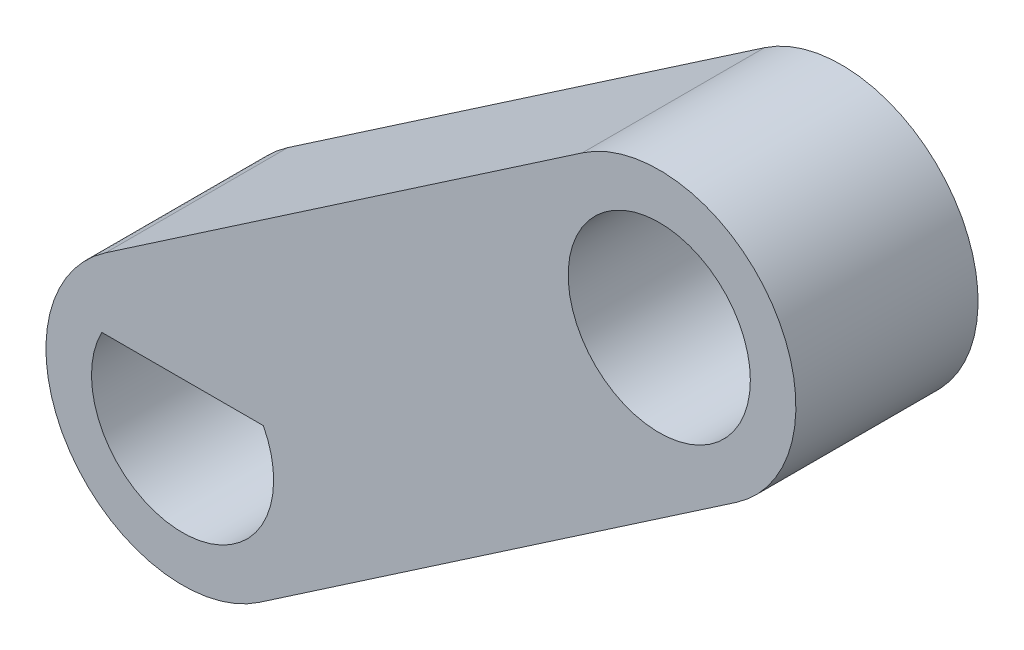
ISO-10303-21;
HEADER;
FILE_DESCRIPTION(('STEP AP214'),'2;1');
FILE_NAME('part.step','',(''),(''),'','','');
FILE_SCHEMA(('AUTOMOTIVE_DESIGN { 1 0 10303 214 1 1 1 1 }'));
ENDSEC;
DATA;
#1=APPLICATION_CONTEXT('core data for automotive mechanical design processes');
#2=APPLICATION_PROTOCOL_DEFINITION('international standard','automotive_design',2000,#1);
#3=PRODUCT_CONTEXT('',#1,'mechanical');
#4=PRODUCT('Part','Part','',(#3));
#5=PRODUCT_RELATED_PRODUCT_CATEGORY('part','',(#4));
#6=PRODUCT_DEFINITION_FORMATION('','',#4);
#7=PRODUCT_DEFINITION_CONTEXT('part definition',#1,'design');
#8=PRODUCT_DEFINITION('design','',#6,#7);
#9=PRODUCT_DEFINITION_SHAPE('','',#8);
#10=(LENGTH_UNIT() NAMED_UNIT(*) SI_UNIT(.MILLI.,.METRE.));
#11=(NAMED_UNIT(*) PLANE_ANGLE_UNIT() SI_UNIT($,.RADIAN.));
#12=(NAMED_UNIT(*) SI_UNIT($,.STERADIAN.) SOLID_ANGLE_UNIT());
#13=UNCERTAINTY_MEASURE_WITH_UNIT(LENGTH_MEASURE(1.E-05),#10,'distance_accuracy_value','');
#14=(GEOMETRIC_REPRESENTATION_CONTEXT(3) GLOBAL_UNCERTAINTY_ASSIGNED_CONTEXT((#13)) GLOBAL_UNIT_ASSIGNED_CONTEXT((#10,
#11,#12)) REPRESENTATION_CONTEXT('',''));
#15=CARTESIAN_POINT('',(0.,0.,0.));
#16=DIRECTION('',(0.,0.,1.));
#17=DIRECTION('',(1.,0.,0.));
#18=AXIS2_PLACEMENT_3D('',#15,#16,#17);
#19=CARTESIAN_POINT('',(-83.5922327227337,661.195137336145,-15.9136635374016));
#20=DIRECTION('',(0.,0.,1.));
#21=DIRECTION('',(1.,0.,0.));
#22=AXIS2_PLACEMENT_3D('',#19,#20,#21);
#23=PLANE('',#22);
#24=CARTESIAN_POINT('',(-83.5922327227337,661.195137336145,-15.9136635374016));
#25=DIRECTION('',(0.,0.,1.));
#26=DIRECTION('',(1.,0.,0.));
#27=AXIS2_PLACEMENT_3D('',#24,#25,#26);
#28=CIRCLE('',#27,14.9999999999999);
#29=CARTESIAN_POINT('',(-92.0395622803212,673.590403502932,-15.9136635374016));
#30=VERTEX_POINT('',#29);
#31=CARTESIAN_POINT('',(-75.1449031651463,648.799871169357,-15.9136635374016));
#32=VERTEX_POINT('',#31);
#33=EDGE_CURVE('E114',#30,#32,#28,.T.);
#34=ORIENTED_EDGE('',*,*,#33,.T.);
#35=DIRECTION('',(0.826351077785841,0.563155303839162,0.));
#36=VECTOR('',#35,1.);
#37=CARTESIAN_POINT('',(-75.1449031651463,648.799871169357,-15.9136635374016));
#38=LINE('',#37,#36);
#39=CARTESIAN_POINT('',(-22.8041540830278,684.469904457737,-15.9136635374016));
#40=VERTEX_POINT('',#39);
#41=EDGE_CURVE('E117',#32,#40,#38,.T.);
#42=ORIENTED_EDGE('',*,*,#41,.T.);
#43=CARTESIAN_POINT('',(-31.2514836406152,696.865170624525,-15.9136635374016));
#44=DIRECTION('',(0.,0.,1.));
#45=DIRECTION('',(1.,0.,0.));
#46=AXIS2_PLACEMENT_3D('',#43,#44,#45);
#47=CIRCLE('',#46,15.);
#48=CARTESIAN_POINT('',(-39.6988131982026,709.260436791313,-15.9136635374016));
#49=VERTEX_POINT('',#48);
#50=EDGE_CURVE('E120',#40,#49,#47,.T.);
#51=ORIENTED_EDGE('',*,*,#50,.T.);
#52=DIRECTION('',(-0.82635107778584,-0.563155303839164,0.));
#53=VECTOR('',#52,1.);
#54=CARTESIAN_POINT('',(-92.0395622803212,673.590403502932,-15.9136635374016));
#55=LINE('',#54,#53);
#56=EDGE_CURVE('E122',#49,#30,#55,.T.);
#57=ORIENTED_EDGE('',*,*,#56,.T.);
#58=EDGE_LOOP('',(#34,#42,#51,#57));
#59=FACE_BOUND('',#58,.T.);
#60=CARTESIAN_POINT('',(-31.2514836406152,696.865170624525,-15.9136635374016));
#61=DIRECTION('',(0.,0.,1.));
#62=DIRECTION('',(1.,0.,0.));
#63=AXIS2_PLACEMENT_3D('',#60,#61,#62);
#64=CIRCLE('',#63,10.);
#65=CARTESIAN_POINT('',(-21.2514836406152,696.865170624525,-15.9136635374016));
#66=VERTEX_POINT('',#65);
#67=EDGE_CURVE('E108',#66,#66,#64,.T.);
#68=ORIENTED_EDGE('',*,*,#67,.F.);
#69=EDGE_LOOP('',(#68));
#70=FACE_BOUND('',#69,.T.);
#71=DIRECTION('',(-1.,0.,0.));
#72=VECTOR('',#71,1.);
#73=CARTESIAN_POINT('',(-74.7223530881653,665.813062766244,-15.9136635374016));
#74=LINE('',#73,#72);
#75=CARTESIAN_POINT('',(-74.7223530881653,665.813062766244,-15.9136635374016));
#76=VERTEX_POINT('',#75);
#77=CARTESIAN_POINT('',(-92.4621123573022,665.813062766244,-15.9136635374016));
#78=VERTEX_POINT('',#77);
#79=EDGE_CURVE('E91',#76,#78,#74,.T.);
#80=ORIENTED_EDGE('',*,*,#79,.F.);
#81=CARTESIAN_POINT('',(-83.5922327227337,661.195137336145,-15.9136635374016));
#82=DIRECTION('',(0.,0.,1.));
#83=DIRECTION('',(1.,0.,0.));
#84=AXIS2_PLACEMENT_3D('',#81,#82,#83);
#85=CIRCLE('',#84,10.0000000004846);
#86=EDGE_CURVE('E97',#78,#76,#85,.T.);
#87=ORIENTED_EDGE('',*,*,#86,.F.);
#88=EDGE_LOOP('',(#80,#87));
#89=FACE_BOUND('',#88,.T.);
#90=ADVANCED_FACE('F39',(#59,#70,#89),#23,.T.);
#91=CARTESIAN_POINT('',(-83.5922327227337,661.195137336145,-35.9136635374016));
#92=DIRECTION('',(0.,0.,1.));
#93=DIRECTION('',(1.,0.,0.));
#94=AXIS2_PLACEMENT_3D('',#91,#92,#93);
#95=PLANE('',#94);
#96=CARTESIAN_POINT('',(-31.2514836406152,696.865170624525,-35.9136635374016));
#97=DIRECTION('',(0.,0.,1.));
#98=DIRECTION('',(1.,0.,0.));
#99=AXIS2_PLACEMENT_3D('',#96,#97,#98);
#100=CIRCLE('',#99,10.);
#101=CARTESIAN_POINT('',(-21.2514836406152,696.865170624525,-35.9136635374016));
#102=VERTEX_POINT('',#101);
#103=EDGE_CURVE('E107',#102,#102,#100,.T.);
#104=ORIENTED_EDGE('',*,*,#103,.T.);
#105=EDGE_LOOP('',(#104));
#106=FACE_BOUND('',#105,.T.);
#107=CARTESIAN_POINT('',(-83.5922327227337,661.195137336145,-35.9136635374016));
#108=DIRECTION('',(0.,0.,1.));
#109=DIRECTION('',(1.,0.,0.));
#110=AXIS2_PLACEMENT_3D('',#107,#108,#109);
#111=CIRCLE('',#110,14.9999999999999);
#112=CARTESIAN_POINT('',(-92.0395622803212,673.590403502932,-35.9136635374016));
#113=VERTEX_POINT('',#112);
#114=CARTESIAN_POINT('',(-75.1449031651463,648.799871169357,-35.9136635374016));
#115=VERTEX_POINT('',#114);
#116=EDGE_CURVE('E111',#113,#115,#111,.T.);
#117=ORIENTED_EDGE('',*,*,#116,.F.);
#118=DIRECTION('',(-0.82635107778584,-0.563155303839164,0.));
#119=VECTOR('',#118,1.);
#120=CARTESIAN_POINT('',(-92.0395622803212,673.590403502932,-35.9136635374016));
#121=LINE('',#120,#119);
#122=CARTESIAN_POINT('',(-39.6988131982026,709.260436791313,-35.9136635374016));
#123=VERTEX_POINT('',#122);
#124=EDGE_CURVE('E118',#123,#113,#121,.T.);
#125=ORIENTED_EDGE('',*,*,#124,.F.);
#126=CARTESIAN_POINT('',(-31.2514836406152,696.865170624525,-35.9136635374016));
#127=DIRECTION('',(0.,0.,1.));
#128=DIRECTION('',(1.,0.,0.));
#129=AXIS2_PLACEMENT_3D('',#126,#127,#128);
#130=CIRCLE('',#129,15.);
#131=CARTESIAN_POINT('',(-22.8041540830278,684.469904457737,-35.9136635374016));
#132=VERTEX_POINT('',#131);
#133=EDGE_CURVE('E129',#132,#123,#130,.T.);
#134=ORIENTED_EDGE('',*,*,#133,.F.);
#135=DIRECTION('',(0.826351077785841,0.563155303839162,0.));
#136=VECTOR('',#135,1.);
#137=CARTESIAN_POINT('',(-75.1449031651463,648.799871169357,-35.9136635374016));
#138=LINE('',#137,#136);
#139=EDGE_CURVE('E127',#115,#132,#138,.T.);
#140=ORIENTED_EDGE('',*,*,#139,.F.);
#141=EDGE_LOOP('',(#117,#125,#134,#140));
#142=FACE_BOUND('',#141,.T.);
#143=CARTESIAN_POINT('',(-83.5922327227337,661.195137336145,-35.9136635374016));
#144=DIRECTION('',(0.,0.,1.));
#145=DIRECTION('',(1.,0.,0.));
#146=AXIS2_PLACEMENT_3D('',#143,#144,#145);
#147=CIRCLE('',#146,10.0000000004846);
#148=CARTESIAN_POINT('',(-92.4621123573022,665.813062766244,-35.9136635374016));
#149=VERTEX_POINT('',#148);
#150=CARTESIAN_POINT('',(-74.7223530881653,665.813062766244,-35.9136635374016));
#151=VERTEX_POINT('',#150);
#152=EDGE_CURVE('E61',#149,#151,#147,.T.);
#153=ORIENTED_EDGE('',*,*,#152,.T.);
#154=DIRECTION('',(-1.,0.,0.));
#155=VECTOR('',#154,1.);
#156=CARTESIAN_POINT('',(-74.7223530881653,665.813062766244,-35.9136635374016));
#157=LINE('',#156,#155);
#158=EDGE_CURVE('E101',#151,#149,#157,.T.);
#159=ORIENTED_EDGE('',*,*,#158,.T.);
#160=EDGE_LOOP('',(#153,#159));
#161=FACE_BOUND('',#160,.T.);
#162=ADVANCED_FACE('F147',(#106,#142,#161),#95,.F.);
#163=CARTESIAN_POINT('',(-83.5922327227337,661.195137336145,-15.9136635374016));
#164=DIRECTION('',(0.,0.,-1.));
#165=DIRECTION('',(-1.,0.,0.));
#166=AXIS2_PLACEMENT_3D('',#163,#164,#165);
#167=CYLINDRICAL_SURFACE('',#166,14.9999999999999);
#168=ORIENTED_EDGE('',*,*,#116,.T.);
#169=DIRECTION('',(0.,0.,-1.));
#170=VECTOR('',#169,1.);
#171=CARTESIAN_POINT('',(-75.1449031651463,648.799871169357,-15.9136635374016));
#172=LINE('',#171,#170);
#173=EDGE_CURVE('E11',#32,#115,#172,.T.);
#174=ORIENTED_EDGE('',*,*,#173,.F.);
#175=ORIENTED_EDGE('',*,*,#33,.F.);
#176=DIRECTION('',(0.,0.,-1.));
#177=VECTOR('',#176,1.);
#178=CARTESIAN_POINT('',(-92.0395622803212,673.590403502932,-15.9136635374016));
#179=LINE('',#178,#177);
#180=EDGE_CURVE('E124',#30,#113,#179,.T.);
#181=ORIENTED_EDGE('',*,*,#180,.T.);
#182=EDGE_LOOP('',(#168,#174,#175,#181));
#183=FACE_BOUND('',#182,.T.);
#184=ADVANCED_FACE('F41',(#183),#167,.T.);
#185=CARTESIAN_POINT('',(-75.1449031651463,648.799871169357,-15.9136635374016));
#186=DIRECTION('',(-0.563155303839162,0.826351077785841,0.));
#187=DIRECTION('',(-0.826351077785841,-0.563155303839162,0.));
#188=AXIS2_PLACEMENT_3D('',#185,#186,#187);
#189=PLANE('',#188);
#190=ORIENTED_EDGE('',*,*,#139,.T.);
#191=DIRECTION('',(0.,0.,-1.));
#192=VECTOR('',#191,1.);
#193=CARTESIAN_POINT('',(-22.8041540830278,684.469904457737,-15.9136635374016));
#194=LINE('',#193,#192);
#195=EDGE_CURVE('E47',#40,#132,#194,.T.);
#196=ORIENTED_EDGE('',*,*,#195,.F.);
#197=ORIENTED_EDGE('',*,*,#41,.F.);
#198=ORIENTED_EDGE('',*,*,#173,.T.);
#199=EDGE_LOOP('',(#190,#196,#197,#198));
#200=FACE_BOUND('',#199,.T.);
#201=ADVANCED_FACE('F158',(#200),#189,.F.);
#202=CARTESIAN_POINT('',(-31.2514836406152,696.865170624525,-15.9136635374016));
#203=DIRECTION('',(0.,0.,-1.));
#204=DIRECTION('',(-1.,0.,0.));
#205=AXIS2_PLACEMENT_3D('',#202,#203,#204);
#206=CYLINDRICAL_SURFACE('',#205,15.);
#207=ORIENTED_EDGE('',*,*,#133,.T.);
#208=DIRECTION('',(0.,0.,-1.));
#209=VECTOR('',#208,1.);
#210=CARTESIAN_POINT('',(-39.6988131982026,709.260436791313,-15.9136635374016));
#211=LINE('',#210,#209);
#212=EDGE_CURVE('E134',#49,#123,#211,.T.);
#213=ORIENTED_EDGE('',*,*,#212,.F.);
#214=ORIENTED_EDGE('',*,*,#50,.F.);
#215=ORIENTED_EDGE('',*,*,#195,.T.);
#216=EDGE_LOOP('',(#207,#213,#214,#215));
#217=FACE_BOUND('',#216,.T.);
#218=ADVANCED_FACE('F141',(#217),#206,.T.);
#219=CARTESIAN_POINT('',(-92.0395622803212,673.590403502932,-15.9136635374016));
#220=DIRECTION('',(0.563155303839164,-0.82635107778584,0.));
#221=DIRECTION('',(0.82635107778584,0.563155303839164,0.));
#222=AXIS2_PLACEMENT_3D('',#219,#220,#221);
#223=PLANE('',#222);
#224=ORIENTED_EDGE('',*,*,#124,.T.);
#225=ORIENTED_EDGE('',*,*,#180,.F.);
#226=ORIENTED_EDGE('',*,*,#56,.F.);
#227=ORIENTED_EDGE('',*,*,#212,.T.);
#228=EDGE_LOOP('',(#224,#225,#226,#227));
#229=FACE_BOUND('',#228,.T.);
#230=ADVANCED_FACE('F151',(#229),#223,.F.);
#231=CARTESIAN_POINT('',(-31.2514836406152,696.865170624525,-15.9136635374016));
#232=DIRECTION('',(0.,0.,-1.));
#233=DIRECTION('',(-1.,0.,0.));
#234=AXIS2_PLACEMENT_3D('',#231,#232,#233);
#235=CYLINDRICAL_SURFACE('',#234,10.);
#236=ORIENTED_EDGE('',*,*,#67,.T.);
#237=EDGE_LOOP('',(#236));
#238=FACE_BOUND('',#237,.T.);
#239=ORIENTED_EDGE('',*,*,#103,.F.);
#240=EDGE_LOOP('',(#239));
#241=FACE_BOUND('',#240,.T.);
#242=ADVANCED_FACE('F173',(#238,#241),#235,.F.);
#243=CARTESIAN_POINT('',(-83.5922327227337,661.195137336145,-15.9136635374016));
#244=DIRECTION('',(0.,0.,-1.));
#245=DIRECTION('',(-1.,0.,0.));
#246=AXIS2_PLACEMENT_3D('',#243,#244,#245);
#247=CYLINDRICAL_SURFACE('',#246,10.0000000004846);
#248=ORIENTED_EDGE('',*,*,#152,.F.);
#249=DIRECTION('',(0.,0.,-1.));
#250=VECTOR('',#249,1.);
#251=CARTESIAN_POINT('',(-92.4621123573022,665.813062766244,-15.9136635374016));
#252=LINE('',#251,#250);
#253=EDGE_CURVE('E93',#78,#149,#252,.T.);
#254=ORIENTED_EDGE('',*,*,#253,.F.);
#255=ORIENTED_EDGE('',*,*,#86,.T.);
#256=DIRECTION('',(0.,0.,-1.));
#257=VECTOR('',#256,1.);
#258=CARTESIAN_POINT('',(-74.7223530881653,665.813062766244,-15.9136635374016));
#259=LINE('',#258,#257);
#260=EDGE_CURVE('E54',#76,#151,#259,.T.);
#261=ORIENTED_EDGE('',*,*,#260,.T.);
#262=EDGE_LOOP('',(#248,#254,#255,#261));
#263=FACE_BOUND('',#262,.T.);
#264=ADVANCED_FACE('F99',(#263),#247,.F.);
#265=CARTESIAN_POINT('',(-74.7223530881653,665.813062766244,-15.9136635374016));
#266=DIRECTION('',(0.,-1.,0.));
#267=DIRECTION('',(0.,0.,-1.));
#268=AXIS2_PLACEMENT_3D('',#265,#266,#267);
#269=PLANE('',#268);
#270=ORIENTED_EDGE('',*,*,#158,.F.);
#271=ORIENTED_EDGE('',*,*,#260,.F.);
#272=ORIENTED_EDGE('',*,*,#79,.T.);
#273=ORIENTED_EDGE('',*,*,#253,.T.);
#274=EDGE_LOOP('',(#270,#271,#272,#273));
#275=FACE_BOUND('',#274,.T.);
#276=ADVANCED_FACE('F92',(#275),#269,.T.);
#277=CLOSED_SHELL('',(#90,#162,#184,#201,#218,#230,#242,#264,#276));
#278=MANIFOLD_SOLID_BREP('B2',#277);
#279=ADVANCED_BREP_SHAPE_REPRESENTATION('',(#18,#278),#14);
#280=SHAPE_DEFINITION_REPRESENTATION(#9,#279);
ENDSEC;
END-ISO-10303-21;
